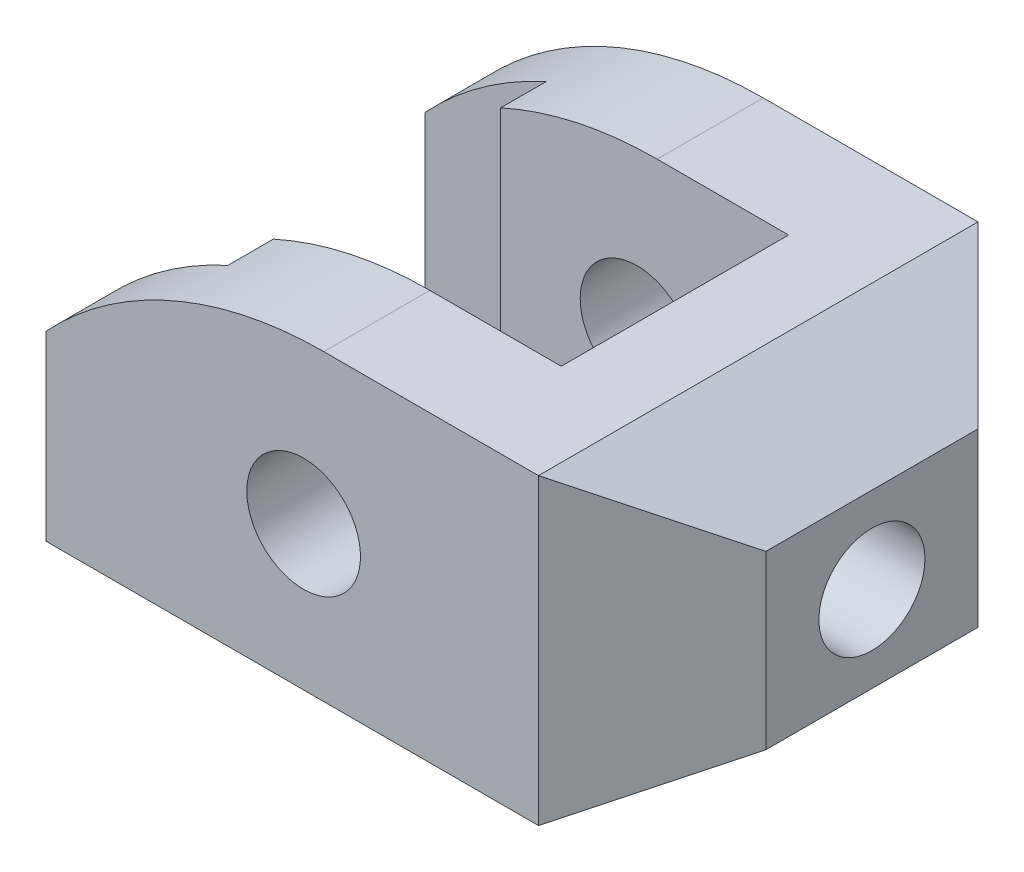
ISO-10303-21;
HEADER;
FILE_DESCRIPTION(('STEP AP214'),'2;1');
FILE_NAME('part.step','',(''),(''),'','','');
FILE_SCHEMA(('AUTOMOTIVE_DESIGN { 1 0 10303 214 1 1 1 1 }'));
ENDSEC;
DATA;
#1=APPLICATION_CONTEXT('core data for automotive mechanical design processes');
#2=APPLICATION_PROTOCOL_DEFINITION('international standard','automotive_design',2000,#1);
#3=PRODUCT_CONTEXT('',#1,'mechanical');
#4=PRODUCT('Part','Part','',(#3));
#5=PRODUCT_RELATED_PRODUCT_CATEGORY('part','',(#4));
#6=PRODUCT_DEFINITION_FORMATION('','',#4);
#7=PRODUCT_DEFINITION_CONTEXT('part definition',#1,'design');
#8=PRODUCT_DEFINITION('design','',#6,#7);
#9=PRODUCT_DEFINITION_SHAPE('','',#8);
#10=(LENGTH_UNIT() NAMED_UNIT(*) SI_UNIT(.MILLI.,.METRE.));
#11=(NAMED_UNIT(*) PLANE_ANGLE_UNIT() SI_UNIT($,.RADIAN.));
#12=(NAMED_UNIT(*) SI_UNIT($,.STERADIAN.) SOLID_ANGLE_UNIT());
#13=UNCERTAINTY_MEASURE_WITH_UNIT(LENGTH_MEASURE(1.E-05),#10,'distance_accuracy_value','');
#14=(GEOMETRIC_REPRESENTATION_CONTEXT(3) GLOBAL_UNCERTAINTY_ASSIGNED_CONTEXT((#13)) GLOBAL_UNIT_ASSIGNED_CONTEXT((#10,
#11,#12)) REPRESENTATION_CONTEXT('',''));
#15=CARTESIAN_POINT('',(0.,0.,0.));
#16=DIRECTION('',(0.,0.,1.));
#17=DIRECTION('',(1.,0.,0.));
#18=AXIS2_PLACEMENT_3D('',#15,#16,#17);
#19=CARTESIAN_POINT('',(36.6606055596467,-10.,29.));
#20=DIRECTION('',(0.,0.,1.));
#21=DIRECTION('',(1.,0.,0.));
#22=AXIS2_PLACEMENT_3D('',#19,#20,#21);
#23=PLANE('',#22);
#24=CARTESIAN_POINT('',(34.,19.,29.));
#25=DIRECTION('',(0.,0.,1.));
#26=DIRECTION('',(1.,0.,0.));
#27=AXIS2_PLACEMENT_3D('',#24,#25,#26);
#28=CIRCLE('',#27,7.5);
#29=CARTESIAN_POINT('',(26.5,19.,29.));
#30=VERTEX_POINT('',#29);
#31=EDGE_CURVE('E278',#30,#30,#28,.T.);
#32=ORIENTED_EDGE('',*,*,#31,.F.);
#33=EDGE_LOOP('',(#32));
#34=FACE_BOUND('',#33,.T.);
#35=DIRECTION('',(1.,0.,0.));
#36=VECTOR('',#35,1.);
#37=CARTESIAN_POINT('',(0.,0.,29.));
#38=LINE('',#37,#36);
#39=CARTESIAN_POINT('',(0.,0.,29.));
#40=VERTEX_POINT('',#39);
#41=CARTESIAN_POINT('',(65.,0.,29.));
#42=VERTEX_POINT('',#41);
#43=EDGE_CURVE('E252',#40,#42,#38,.T.);
#44=ORIENTED_EDGE('',*,*,#43,.T.);
#45=DIRECTION('',(0.,-1.,0.));
#46=VECTOR('',#45,1.);
#47=CARTESIAN_POINT('',(65.,58.,29.));
#48=LINE('',#47,#46);
#49=CARTESIAN_POINT('',(65.,40.,29.));
#50=VERTEX_POINT('',#49);
#51=EDGE_CURVE('E242',#50,#42,#48,.T.);
#52=ORIENTED_EDGE('',*,*,#51,.F.);
#53=DIRECTION('',(-1.,0.,0.));
#54=VECTOR('',#53,1.);
#55=CARTESIAN_POINT('',(65.,40.,29.));
#56=LINE('',#55,#54);
#57=CARTESIAN_POINT('',(36.6606055596467,40.,29.));
#58=VERTEX_POINT('',#57);
#59=EDGE_CURVE('E249',#50,#58,#56,.T.);
#60=ORIENTED_EDGE('',*,*,#59,.T.);
#61=CARTESIAN_POINT('',(36.6606055596467,-10.,29.));
#62=DIRECTION('',(0.,0.,1.));
#63=DIRECTION('',(1.,0.,0.));
#64=AXIS2_PLACEMENT_3D('',#61,#62,#63);
#65=CIRCLE('',#64,50.);
#66=CARTESIAN_POINT('',(0.,24.,29.));
#67=VERTEX_POINT('',#66);
#68=EDGE_CURVE('E267',#58,#67,#65,.T.);
#69=ORIENTED_EDGE('',*,*,#68,.T.);
#70=DIRECTION('',(0.,-1.,0.));
#71=VECTOR('',#70,1.);
#72=CARTESIAN_POINT('',(0.,0.,29.));
#73=LINE('',#72,#71);
#74=EDGE_CURVE('E273',#67,#40,#73,.T.);
#75=ORIENTED_EDGE('',*,*,#74,.T.);
#76=EDGE_LOOP('',(#44,#52,#60,#69,#75));
#77=FACE_BOUND('',#76,.T.);
#78=ADVANCED_FACE('F44',(#34,#77),#23,.T.);
#79=CARTESIAN_POINT('',(36.6606055596467,-10.,-29.));
#80=DIRECTION('',(0.,0.,1.));
#81=DIRECTION('',(1.,0.,0.));
#82=AXIS2_PLACEMENT_3D('',#79,#80,#81);
#83=PLANE('',#82);
#84=CARTESIAN_POINT('',(34.,19.,-29.));
#85=DIRECTION('',(0.,0.,1.));
#86=DIRECTION('',(1.,0.,0.));
#87=AXIS2_PLACEMENT_3D('',#84,#85,#86);
#88=CIRCLE('',#87,7.5);
#89=CARTESIAN_POINT('',(26.5,19.,-29.));
#90=VERTEX_POINT('',#89);
#91=EDGE_CURVE('E361',#90,#90,#88,.T.);
#92=ORIENTED_EDGE('',*,*,#91,.T.);
#93=EDGE_LOOP('',(#92));
#94=FACE_BOUND('',#93,.T.);
#95=DIRECTION('',(0.,-1.,0.));
#96=VECTOR('',#95,1.);
#97=CARTESIAN_POINT('',(65.,58.,-29.));
#98=LINE('',#97,#96);
#99=CARTESIAN_POINT('',(65.,40.,-29.));
#100=VERTEX_POINT('',#99);
#101=CARTESIAN_POINT('',(65.,0.,-29.));
#102=VERTEX_POINT('',#101);
#103=EDGE_CURVE('E160',#100,#102,#98,.T.);
#104=ORIENTED_EDGE('',*,*,#103,.T.);
#105=DIRECTION('',(1.,0.,0.));
#106=VECTOR('',#105,1.);
#107=CARTESIAN_POINT('',(0.,0.,-29.));
#108=LINE('',#107,#106);
#109=CARTESIAN_POINT('',(0.,0.,-29.));
#110=VERTEX_POINT('',#109);
#111=EDGE_CURVE('E178',#110,#102,#108,.T.);
#112=ORIENTED_EDGE('',*,*,#111,.F.);
#113=DIRECTION('',(0.,-1.,0.));
#114=VECTOR('',#113,1.);
#115=CARTESIAN_POINT('',(0.,0.,-29.));
#116=LINE('',#115,#114);
#117=CARTESIAN_POINT('',(0.,24.,-29.));
#118=VERTEX_POINT('',#117);
#119=EDGE_CURVE('E194',#118,#110,#116,.T.);
#120=ORIENTED_EDGE('',*,*,#119,.F.);
#121=CARTESIAN_POINT('',(36.6606055596467,-10.,-29.));
#122=DIRECTION('',(0.,0.,1.));
#123=DIRECTION('',(1.,0.,0.));
#124=AXIS2_PLACEMENT_3D('',#121,#122,#123);
#125=CIRCLE('',#124,50.);
#126=CARTESIAN_POINT('',(36.6606055596467,40.,-29.));
#127=VERTEX_POINT('',#126);
#128=EDGE_CURVE('E282',#127,#118,#125,.T.);
#129=ORIENTED_EDGE('',*,*,#128,.F.);
#130=DIRECTION('',(-1.,0.,0.));
#131=VECTOR('',#130,1.);
#132=CARTESIAN_POINT('',(65.,40.,-29.));
#133=LINE('',#132,#131);
#134=EDGE_CURVE('E182',#100,#127,#133,.T.);
#135=ORIENTED_EDGE('',*,*,#134,.F.);
#136=EDGE_LOOP('',(#104,#112,#120,#129,#135));
#137=FACE_BOUND('',#136,.T.);
#138=ADVANCED_FACE('F176',(#94,#137),#83,.F.);
#139=CARTESIAN_POINT('',(65.,0.,29.));
#140=DIRECTION('',(-0.500000000000001,0.866025403784438,0.));
#141=DIRECTION('',(-0.866025403784438,-0.500000000000001,0.));
#142=AXIS2_PLACEMENT_3D('',#139,#140,#141);
#143=PLANE('',#142);
#144=DIRECTION('',(-0.65465367070798,-0.37796447300923,-0.654653670707973));
#145=VECTOR('',#144,1.);
#146=CARTESIAN_POINT('',(89.8571428571428,14.3512781198564,-4.14285714285747));
#147=LINE('',#146,#145);
#148=CARTESIAN_POINT('',(80.,8.66025403784443,-14.0000000000002));
#149=VERTEX_POINT('',#148);
#150=EDGE_CURVE('E157',#149,#102,#147,.T.);
#151=ORIENTED_EDGE('',*,*,#150,.F.);
#152=DIRECTION('',(0.,0.,-1.));
#153=VECTOR('',#152,1.);
#154=CARTESIAN_POINT('',(80.,8.66025403784441,29.));
#155=LINE('',#154,#153);
#156=CARTESIAN_POINT('',(80.,8.66025403784443,14.0000000000002));
#157=VERTEX_POINT('',#156);
#158=EDGE_CURVE('E200',#157,#149,#155,.T.);
#159=ORIENTED_EDGE('',*,*,#158,.F.);
#160=DIRECTION('',(0.65465367070798,0.37796447300923,-0.654653670707973));
#161=VECTOR('',#160,1.);
#162=CARTESIAN_POINT('',(65.,0.,29.));
#163=LINE('',#162,#161);
#164=EDGE_CURVE('E170',#42,#157,#163,.T.);
#165=ORIENTED_EDGE('',*,*,#164,.F.);
#166=DIRECTION('',(0.,0.,-1.));
#167=VECTOR('',#166,1.);
#168=CARTESIAN_POINT('',(65.,0.,29.));
#169=LINE('',#168,#167);
#170=EDGE_CURVE('E189',#42,#102,#169,.T.);
#171=ORIENTED_EDGE('',*,*,#170,.T.);
#172=EDGE_LOOP('',(#151,#159,#165,#171));
#173=FACE_BOUND('',#172,.T.);
#174=ADVANCED_FACE('F197',(#173),#143,.F.);
#175=CARTESIAN_POINT('',(80.,8.66025403784441,29.));
#176=DIRECTION('',(-1.,0.,0.));
#177=DIRECTION('',(0.,0.,1.));
#178=AXIS2_PLACEMENT_3D('',#175,#176,#177);
#179=PLANE('',#178);
#180=CARTESIAN_POINT('',(80.,20.,0.));
#181=DIRECTION('',(1.,0.,0.));
#182=DIRECTION('',(0.,0.,-1.));
#183=AXIS2_PLACEMENT_3D('',#180,#181,#182);
#184=CIRCLE('',#183,7.);
#185=CARTESIAN_POINT('',(80.,20.,-7.));
#186=VERTEX_POINT('',#185);
#187=EDGE_CURVE('E298',#186,#186,#184,.T.);
#188=ORIENTED_EDGE('',*,*,#187,.F.);
#189=EDGE_LOOP('',(#188));
#190=FACE_BOUND('',#189,.T.);
#191=DIRECTION('',(0.,-1.,0.));
#192=VECTOR('',#191,1.);
#193=CARTESIAN_POINT('',(80.,58.,-14.0000000000002));
#194=LINE('',#193,#192);
#195=CARTESIAN_POINT('',(80.,31.3397459621556,-14.0000000000002));
#196=VERTEX_POINT('',#195);
#197=EDGE_CURVE('E163',#196,#149,#194,.T.);
#198=ORIENTED_EDGE('',*,*,#197,.F.);
#199=DIRECTION('',(0.,0.,-1.));
#200=VECTOR('',#199,1.);
#201=CARTESIAN_POINT('',(80.,31.3397459621556,29.));
#202=LINE('',#201,#200);
#203=CARTESIAN_POINT('',(80.,31.3397459621556,14.0000000000002));
#204=VERTEX_POINT('',#203);
#205=EDGE_CURVE('E206',#204,#196,#202,.T.);
#206=ORIENTED_EDGE('',*,*,#205,.F.);
#207=DIRECTION('',(0.,-1.,0.));
#208=VECTOR('',#207,1.);
#209=CARTESIAN_POINT('',(80.,58.,14.0000000000002));
#210=LINE('',#209,#208);
#211=EDGE_CURVE('E61',#204,#157,#210,.T.);
#212=ORIENTED_EDGE('',*,*,#211,.T.);
#213=ORIENTED_EDGE('',*,*,#158,.T.);
#214=EDGE_LOOP('',(#198,#206,#212,#213));
#215=FACE_BOUND('',#214,.T.);
#216=ADVANCED_FACE('F294',(#190,#215),#179,.F.);
#217=CARTESIAN_POINT('',(80.,31.3397459621556,29.));
#218=DIRECTION('',(-0.500000000000001,-0.866025403784438,0.));
#219=DIRECTION('',(0.866025403784438,-0.500000000000001,0.));
#220=AXIS2_PLACEMENT_3D('',#217,#218,#219);
#221=PLANE('',#220);
#222=DIRECTION('',(0.65465367070798,-0.37796447300923,0.654653670707973));
#223=VECTOR('',#222,1.);
#224=CARTESIAN_POINT('',(98.4285714285715,20.7000052870896,4.4285714285711));
#225=LINE('',#224,#223);
#226=EDGE_CURVE('E11',#100,#196,#225,.T.);
#227=ORIENTED_EDGE('',*,*,#226,.F.);
#228=DIRECTION('',(0.,0.,-1.));
#229=VECTOR('',#228,1.);
#230=CARTESIAN_POINT('',(65.,40.,29.));
#231=LINE('',#230,#229);
#232=EDGE_CURVE('E256',#50,#100,#231,.T.);
#233=ORIENTED_EDGE('',*,*,#232,.F.);
#234=DIRECTION('',(-0.65465367070798,0.37796447300923,0.654653670707973));
#235=VECTOR('',#234,1.);
#236=CARTESIAN_POINT('',(73.5714285714287,35.051283406946,20.4285714285714));
#237=LINE('',#236,#235);
#238=EDGE_CURVE('E54',#204,#50,#237,.T.);
#239=ORIENTED_EDGE('',*,*,#238,.F.);
#240=ORIENTED_EDGE('',*,*,#205,.T.);
#241=EDGE_LOOP('',(#227,#233,#239,#240));
#242=FACE_BOUND('',#241,.T.);
#243=ADVANCED_FACE('F257',(#242),#221,.F.);
#244=CARTESIAN_POINT('',(0.,0.,29.));
#245=DIRECTION('',(1.,0.,0.));
#246=DIRECTION('',(0.,0.,-1.));
#247=AXIS2_PLACEMENT_3D('',#244,#245,#246);
#248=PLANE('',#247);
#249=DIRECTION('',(0.,-1.,0.));
#250=VECTOR('',#249,1.);
#251=CARTESIAN_POINT('',(0.,58.,21.));
#252=LINE('',#251,#250);
#253=CARTESIAN_POINT('',(0.,24.,21.));
#254=VERTEX_POINT('',#253);
#255=CARTESIAN_POINT('',(0.,0.,21.));
#256=VERTEX_POINT('',#255);
#257=EDGE_CURVE('E218',#254,#256,#252,.T.);
#258=ORIENTED_EDGE('',*,*,#257,.T.);
#259=DIRECTION('',(0.,0.,-1.));
#260=VECTOR('',#259,1.);
#261=CARTESIAN_POINT('',(0.,0.,29.));
#262=LINE('',#261,#260);
#263=EDGE_CURVE('E204',#40,#256,#262,.T.);
#264=ORIENTED_EDGE('',*,*,#263,.F.);
#265=ORIENTED_EDGE('',*,*,#74,.F.);
#266=DIRECTION('',(0.,0.,-1.));
#267=VECTOR('',#266,1.);
#268=CARTESIAN_POINT('',(0.,24.,29.));
#269=LINE('',#268,#267);
#270=EDGE_CURVE('E286',#67,#254,#269,.T.);
#271=ORIENTED_EDGE('',*,*,#270,.T.);
#272=EDGE_LOOP('',(#258,#264,#265,#271));
#273=FACE_BOUND('',#272,.T.);
#274=ADVANCED_FACE('F46',(#273),#248,.F.);
#275=DIRECTION('',(0.,-1.,0.));
#276=VECTOR('',#275,1.);
#277=CARTESIAN_POINT('',(0.,58.,-21.));
#278=LINE('',#277,#276);
#279=CARTESIAN_POINT('',(0.,24.,-21.));
#280=VERTEX_POINT('',#279);
#281=CARTESIAN_POINT('',(0.,0.,-21.));
#282=VERTEX_POINT('',#281);
#283=EDGE_CURVE('E329',#280,#282,#278,.T.);
#284=ORIENTED_EDGE('',*,*,#283,.F.);
#285=EDGE_CURVE('E271',#280,#118,#269,.T.);
#286=ORIENTED_EDGE('',*,*,#285,.T.);
#287=ORIENTED_EDGE('',*,*,#119,.T.);
#288=EDGE_CURVE('E192',#282,#110,#262,.T.);
#289=ORIENTED_EDGE('',*,*,#288,.F.);
#290=EDGE_LOOP('',(#284,#286,#287,#289));
#291=FACE_BOUND('',#290,.T.);
#292=ADVANCED_FACE('F403',(#291),#248,.F.);
#293=CARTESIAN_POINT('',(0.,0.,29.));
#294=DIRECTION('',(0.,1.,0.));
#295=DIRECTION('',(0.,0.,1.));
#296=AXIS2_PLACEMENT_3D('',#293,#294,#295);
#297=PLANE('',#296);
#298=DIRECTION('',(1.,0.,0.));
#299=VECTOR('',#298,1.);
#300=CARTESIAN_POINT('',(0.,0.,21.));
#301=LINE('',#300,#299);
#302=CARTESIAN_POINT('',(16.,0.,21.));
#303=VERTEX_POINT('',#302);
#304=EDGE_CURVE('E169',#256,#303,#301,.T.);
#305=ORIENTED_EDGE('',*,*,#304,.T.);
#306=DIRECTION('',(0.,0.,-1.));
#307=VECTOR('',#306,1.);
#308=CARTESIAN_POINT('',(16.,0.,15.));
#309=LINE('',#308,#307);
#310=CARTESIAN_POINT('',(16.,0.,15.));
#311=VERTEX_POINT('',#310);
#312=EDGE_CURVE('E306',#303,#311,#309,.T.);
#313=ORIENTED_EDGE('',*,*,#312,.T.);
#314=DIRECTION('',(1.,0.,0.));
#315=VECTOR('',#314,1.);
#316=CARTESIAN_POINT('',(16.,0.,15.));
#317=LINE('',#316,#315);
#318=CARTESIAN_POINT('',(54.,0.,15.));
#319=VERTEX_POINT('',#318);
#320=EDGE_CURVE('E310',#311,#319,#317,.T.);
#321=ORIENTED_EDGE('',*,*,#320,.T.);
#322=DIRECTION('',(0.,0.,-1.));
#323=VECTOR('',#322,1.);
#324=CARTESIAN_POINT('',(54.,0.,-15.));
#325=LINE('',#324,#323);
#326=CARTESIAN_POINT('',(54.,0.,-15.));
#327=VERTEX_POINT('',#326);
#328=EDGE_CURVE('E314',#319,#327,#325,.T.);
#329=ORIENTED_EDGE('',*,*,#328,.T.);
#330=DIRECTION('',(-1.,0.,0.));
#331=VECTOR('',#330,1.);
#332=CARTESIAN_POINT('',(16.,0.,-15.));
#333=LINE('',#332,#331);
#334=CARTESIAN_POINT('',(16.,0.,-15.));
#335=VERTEX_POINT('',#334);
#336=EDGE_CURVE('E318',#327,#335,#333,.T.);
#337=ORIENTED_EDGE('',*,*,#336,.T.);
#338=DIRECTION('',(0.,0.,-1.));
#339=VECTOR('',#338,1.);
#340=CARTESIAN_POINT('',(16.,0.,-21.));
#341=LINE('',#340,#339);
#342=CARTESIAN_POINT('',(16.,0.,-21.));
#343=VERTEX_POINT('',#342);
#344=EDGE_CURVE('E322',#335,#343,#341,.T.);
#345=ORIENTED_EDGE('',*,*,#344,.T.);
#346=DIRECTION('',(-1.,0.,0.));
#347=VECTOR('',#346,1.);
#348=CARTESIAN_POINT('',(0.,0.,-21.));
#349=LINE('',#348,#347);
#350=EDGE_CURVE('E326',#343,#282,#349,.T.);
#351=ORIENTED_EDGE('',*,*,#350,.T.);
#352=ORIENTED_EDGE('',*,*,#288,.T.);
#353=ORIENTED_EDGE('',*,*,#111,.T.);
#354=ORIENTED_EDGE('',*,*,#170,.F.);
#355=ORIENTED_EDGE('',*,*,#43,.F.);
#356=ORIENTED_EDGE('',*,*,#263,.T.);
#357=EDGE_LOOP('',(#305,#313,#321,#329,#337,#345,#351,#352,#353,#354,#355,#356));
#358=FACE_BOUND('',#357,.T.);
#359=ADVANCED_FACE('F188',(#358),#297,.F.);
#360=CARTESIAN_POINT('',(65.,40.,29.));
#361=DIRECTION('',(0.,-1.,0.));
#362=DIRECTION('',(1.,0.,0.));
#363=AXIS2_PLACEMENT_3D('',#360,#361,#362);
#364=PLANE('',#363);
#365=DIRECTION('',(1.,0.,0.));
#366=VECTOR('',#365,1.);
#367=CARTESIAN_POINT('',(65.,40.,15.));
#368=LINE('',#367,#366);
#369=CARTESIAN_POINT('',(36.6606055596467,40.,15.));
#370=VERTEX_POINT('',#369);
#371=CARTESIAN_POINT('',(54.,40.,15.));
#372=VERTEX_POINT('',#371);
#373=EDGE_CURVE('E358',#370,#372,#368,.T.);
#374=ORIENTED_EDGE('',*,*,#373,.F.);
#375=DIRECTION('',(0.,0.,-1.));
#376=VECTOR('',#375,1.);
#377=CARTESIAN_POINT('',(36.6606055596467,40.,29.));
#378=LINE('',#377,#376);
#379=EDGE_CURVE('E260',#58,#370,#378,.T.);
#380=ORIENTED_EDGE('',*,*,#379,.F.);
#381=ORIENTED_EDGE('',*,*,#59,.F.);
#382=ORIENTED_EDGE('',*,*,#232,.T.);
#383=ORIENTED_EDGE('',*,*,#134,.T.);
#384=CARTESIAN_POINT('',(36.6606055596467,40.,-15.));
#385=VERTEX_POINT('',#384);
#386=EDGE_CURVE('E290',#385,#127,#378,.T.);
#387=ORIENTED_EDGE('',*,*,#386,.F.);
#388=DIRECTION('',(-1.,0.,0.));
#389=VECTOR('',#388,1.);
#390=CARTESIAN_POINT('',(65.,40.,-15.));
#391=LINE('',#390,#389);
#392=CARTESIAN_POINT('',(54.,40.,-15.));
#393=VERTEX_POINT('',#392);
#394=EDGE_CURVE('E224',#393,#385,#391,.T.);
#395=ORIENTED_EDGE('',*,*,#394,.F.);
#396=DIRECTION('',(0.,0.,-1.));
#397=VECTOR('',#396,1.);
#398=CARTESIAN_POINT('',(54.,40.,29.));
#399=LINE('',#398,#397);
#400=EDGE_CURVE('E236',#372,#393,#399,.T.);
#401=ORIENTED_EDGE('',*,*,#400,.F.);
#402=EDGE_LOOP('',(#374,#380,#381,#382,#383,#387,#395,#401));
#403=FACE_BOUND('',#402,.T.);
#404=ADVANCED_FACE('F263',(#403),#364,.F.);
#405=CARTESIAN_POINT('',(36.6606055596467,-10.,29.));
#406=DIRECTION('',(0.,0.,-1.));
#407=DIRECTION('',(-1.,0.,0.));
#408=AXIS2_PLACEMENT_3D('',#405,#406,#407);
#409=CYLINDRICAL_SURFACE('',#408,50.);
#410=CARTESIAN_POINT('',(36.6606055596467,-10.,21.));
#411=DIRECTION('',(0.,0.,-1.));
#412=DIRECTION('',(-1.,0.,0.));
#413=AXIS2_PLACEMENT_3D('',#410,#411,#412);
#414=CIRCLE('',#413,50.);
#415=CARTESIAN_POINT('',(16.,35.5317403347236,21.));
#416=VERTEX_POINT('',#415);
#417=EDGE_CURVE('E233',#254,#416,#414,.T.);
#418=ORIENTED_EDGE('',*,*,#417,.F.);
#419=ORIENTED_EDGE('',*,*,#270,.F.);
#420=ORIENTED_EDGE('',*,*,#68,.F.);
#421=ORIENTED_EDGE('',*,*,#379,.T.);
#422=CARTESIAN_POINT('',(36.6606055596467,-10.,15.));
#423=DIRECTION('',(0.,0.,-1.));
#424=DIRECTION('',(-1.,0.,0.));
#425=AXIS2_PLACEMENT_3D('',#422,#423,#424);
#426=CIRCLE('',#425,50.);
#427=CARTESIAN_POINT('',(16.,35.5317403347236,15.));
#428=VERTEX_POINT('',#427);
#429=EDGE_CURVE('E223',#428,#370,#426,.T.);
#430=ORIENTED_EDGE('',*,*,#429,.F.);
#431=DIRECTION('',(0.,0.,-1.));
#432=VECTOR('',#431,1.);
#433=CARTESIAN_POINT('',(16.,35.5317403347236,29.));
#434=LINE('',#433,#432);
#435=EDGE_CURVE('E230',#416,#428,#434,.T.);
#436=ORIENTED_EDGE('',*,*,#435,.F.);
#437=EDGE_LOOP('',(#418,#419,#420,#421,#430,#436));
#438=FACE_BOUND('',#437,.T.);
#439=ADVANCED_FACE('F412',(#438),#409,.T.);
#440=CARTESIAN_POINT('',(36.6606055596467,-10.,-15.));
#441=DIRECTION('',(0.,0.,1.));
#442=DIRECTION('',(1.,0.,0.));
#443=AXIS2_PLACEMENT_3D('',#440,#441,#442);
#444=CIRCLE('',#443,50.);
#445=CARTESIAN_POINT('',(16.,35.5317403347236,-15.));
#446=VERTEX_POINT('',#445);
#447=EDGE_CURVE('E217',#385,#446,#444,.T.);
#448=ORIENTED_EDGE('',*,*,#447,.F.);
#449=ORIENTED_EDGE('',*,*,#386,.T.);
#450=ORIENTED_EDGE('',*,*,#128,.T.);
#451=ORIENTED_EDGE('',*,*,#285,.F.);
#452=CARTESIAN_POINT('',(36.6606055596467,-10.,-21.));
#453=DIRECTION('',(0.,0.,1.));
#454=DIRECTION('',(1.,0.,0.));
#455=AXIS2_PLACEMENT_3D('',#452,#453,#454);
#456=CIRCLE('',#455,50.);
#457=CARTESIAN_POINT('',(16.,35.5317403347236,-21.));
#458=VERTEX_POINT('',#457);
#459=EDGE_CURVE('E212',#458,#280,#456,.T.);
#460=ORIENTED_EDGE('',*,*,#459,.F.);
#461=DIRECTION('',(0.,0.,-1.));
#462=VECTOR('',#461,1.);
#463=CARTESIAN_POINT('',(16.,35.5317403347236,29.));
#464=LINE('',#463,#462);
#465=EDGE_CURVE('E227',#446,#458,#464,.T.);
#466=ORIENTED_EDGE('',*,*,#465,.F.);
#467=EDGE_LOOP('',(#448,#449,#450,#451,#460,#466));
#468=FACE_BOUND('',#467,.T.);
#469=ADVANCED_FACE('F406',(#468),#409,.T.);
#470=CARTESIAN_POINT('',(34.,19.,29.));
#471=DIRECTION('',(0.,0.,-1.));
#472=DIRECTION('',(-1.,0.,0.));
#473=AXIS2_PLACEMENT_3D('',#470,#471,#472);
#474=CYLINDRICAL_SURFACE('',#473,7.5);
#475=CARTESIAN_POINT('',(34.,19.,15.));
#476=DIRECTION('',(0.,0.,-1.));
#477=DIRECTION('',(-1.,0.,0.));
#478=AXIS2_PLACEMENT_3D('',#475,#476,#477);
#479=CIRCLE('',#478,7.5);
#480=CARTESIAN_POINT('',(26.5,19.,15.));
#481=VERTEX_POINT('',#480);
#482=EDGE_CURVE('E219',#481,#481,#479,.T.);
#483=CARTESIAN_POINT('',(26.5,19.,29.));
#484=CARTESIAN_POINT('',(26.5,19.,28.8541666666667));
#485=CARTESIAN_POINT('',(26.5,19.,28.7083333333333));
#486=CARTESIAN_POINT('',(26.5,19.,28.4166666666667));
#487=CARTESIAN_POINT('',(26.5,19.,28.2708333333333));
#488=CARTESIAN_POINT('',(26.5,19.,27.9791666666667));
#489=CARTESIAN_POINT('',(26.5,19.,27.8333333333333));
#490=CARTESIAN_POINT('',(26.5,19.,27.5416666666667));
#491=CARTESIAN_POINT('',(26.5,19.,27.3958333333333));
#492=CARTESIAN_POINT('',(26.5,19.,27.1041666666667));
#493=CARTESIAN_POINT('',(26.5,19.,26.9583333333333));
#494=CARTESIAN_POINT('',(26.5,19.,26.6666666666667));
#495=CARTESIAN_POINT('',(26.5,19.,26.5208333333333));
#496=CARTESIAN_POINT('',(26.5,19.,26.2291666666667));
#497=CARTESIAN_POINT('',(26.5,19.,26.0833333333333));
#498=CARTESIAN_POINT('',(26.5,19.,25.7916666666667));
#499=CARTESIAN_POINT('',(26.5,19.,25.6458333333333));
#500=CARTESIAN_POINT('',(26.5,19.,25.3541666666667));
#501=CARTESIAN_POINT('',(26.5,19.,25.2083333333333));
#502=CARTESIAN_POINT('',(26.5,19.,24.9166666666667));
#503=CARTESIAN_POINT('',(26.5,19.,24.7708333333333));
#504=CARTESIAN_POINT('',(26.5,19.,24.4791666666667));
#505=CARTESIAN_POINT('',(26.5,19.,24.3333333333333));
#506=CARTESIAN_POINT('',(26.5,19.,24.0416666666667));
#507=CARTESIAN_POINT('',(26.5,19.,23.8958333333333));
#508=CARTESIAN_POINT('',(26.5,19.,23.6041666666667));
#509=CARTESIAN_POINT('',(26.5,19.,23.4583333333333));
#510=CARTESIAN_POINT('',(26.5,19.,23.1666666666667));
#511=CARTESIAN_POINT('',(26.5,19.,23.0208333333333));
#512=CARTESIAN_POINT('',(26.5,19.,22.7291666666667));
#513=CARTESIAN_POINT('',(26.5,19.,22.5833333333333));
#514=CARTESIAN_POINT('',(26.5,19.,22.2916666666667));
#515=CARTESIAN_POINT('',(26.5,19.,22.1458333333333));
#516=CARTESIAN_POINT('',(26.5,19.,21.8541666666667));
#517=CARTESIAN_POINT('',(26.5,19.,21.7083333333333));
#518=CARTESIAN_POINT('',(26.5,19.,21.4166666666667));
#519=CARTESIAN_POINT('',(26.5,19.,21.2708333333333));
#520=CARTESIAN_POINT('',(26.5,19.,20.9791666666667));
#521=CARTESIAN_POINT('',(26.5,19.,20.8333333333333));
#522=CARTESIAN_POINT('',(26.5,19.,20.5416666666667));
#523=CARTESIAN_POINT('',(26.5,19.,20.3958333333333));
#524=CARTESIAN_POINT('',(26.5,19.,20.1041666666667));
#525=CARTESIAN_POINT('',(26.5,19.,19.9583333333333));
#526=CARTESIAN_POINT('',(26.5,19.,19.6666666666667));
#527=CARTESIAN_POINT('',(26.5,19.,19.5208333333333));
#528=CARTESIAN_POINT('',(26.5,19.,19.2291666666667));
#529=CARTESIAN_POINT('',(26.5,19.,19.0833333333333));
#530=CARTESIAN_POINT('',(26.5,19.,18.7916666666667));
#531=CARTESIAN_POINT('',(26.5,19.,18.6458333333333));
#532=CARTESIAN_POINT('',(26.5,19.,18.3541666666667));
#533=CARTESIAN_POINT('',(26.5,19.,18.2083333333333));
#534=CARTESIAN_POINT('',(26.5,19.,17.9166666666667));
#535=CARTESIAN_POINT('',(26.5,19.,17.7708333333333));
#536=CARTESIAN_POINT('',(26.5,19.,17.4791666666667));
#537=CARTESIAN_POINT('',(26.5,19.,17.3333333333333));
#538=CARTESIAN_POINT('',(26.5,19.,17.0416666666667));
#539=CARTESIAN_POINT('',(26.5,19.,16.8958333333333));
#540=CARTESIAN_POINT('',(26.5,19.,16.6041666666667));
#541=CARTESIAN_POINT('',(26.5,19.,16.4583333333333));
#542=CARTESIAN_POINT('',(26.5,19.,16.1666666666667));
#543=CARTESIAN_POINT('',(26.5,19.,16.0208333333333));
#544=CARTESIAN_POINT('',(26.5,19.,15.7291666666667));
#545=CARTESIAN_POINT('',(26.5,19.,15.5833333333333));
#546=CARTESIAN_POINT('',(26.5,19.,15.2916666666667));
#547=CARTESIAN_POINT('',(26.5,19.,15.1458333333333));
#548=CARTESIAN_POINT('',(26.5,19.,15.));
#549=B_SPLINE_CURVE_WITH_KNOTS('',3,(#483,#484,#485,#486,#487,#488,#489,#490,#491,#492,#493,
#494,#495,#496,#497,#498,#499,#500,#501,#502,#503,#504,#505,#506,#507,#508,#509,#510,#511,#512,
#513,#514,#515,#516,#517,#518,#519,#520,#521,#522,#523,#524,#525,#526,#527,#528,#529,#530,#531,
#532,#533,#534,#535,#536,#537,#538,#539,#540,#541,#542,#543,#544,#545,#546,#547,#548),
.UNSPECIFIED.,.F.,.F.,(4,2,2,2,2,2,2,2,2,2,2,2,2,2,2,2,2,2,2,2,2,2,2,2,2,2,2,2,2,2,2,2,4),(0.,
0.437499999999997,0.874999999999997,1.3125,1.75,2.1875,2.625,3.0625,3.5,3.9375,4.375,4.8125,
5.25,5.6875,6.125,6.5625,7.,7.4375,7.875,8.3125,8.75,9.1875,9.625,10.0625,10.5,10.9375,11.375,
11.8125,12.25,12.6875,13.125,13.5625,14.),.UNSPECIFIED.);
#550=EDGE_CURVE('BSEAM419',#30,#481,#549,.T.);
#551=ORIENTED_EDGE('',*,*,#31,.T.);
#552=ORIENTED_EDGE('',*,*,#482,.T.);
#553=ORIENTED_EDGE('',*,*,#550,.T.);
#554=ORIENTED_EDGE('',*,*,#550,.F.);
#555=EDGE_LOOP('',(#551,#553,#552,#554));
#556=FACE_BOUND('',#555,.T.);
#557=ADVANCED_FACE('F419',(#556),#474,.F.);
#558=CARTESIAN_POINT('',(34.,19.,-15.));
#559=DIRECTION('',(0.,0.,1.));
#560=DIRECTION('',(1.,0.,0.));
#561=AXIS2_PLACEMENT_3D('',#558,#559,#560);
#562=CIRCLE('',#561,7.5);
#563=CARTESIAN_POINT('',(26.5,19.,-15.));
#564=VERTEX_POINT('',#563);
#565=EDGE_CURVE('E213',#564,#564,#562,.T.);
#566=CARTESIAN_POINT('',(26.5,19.,-29.));
#567=CARTESIAN_POINT('',(26.5,19.,-28.8541666666667));
#568=CARTESIAN_POINT('',(26.5,19.,-28.7083333333333));
#569=CARTESIAN_POINT('',(26.5,19.,-28.4166666666667));
#570=CARTESIAN_POINT('',(26.5,19.,-28.2708333333333));
#571=CARTESIAN_POINT('',(26.5,19.,-27.9791666666667));
#572=CARTESIAN_POINT('',(26.5,19.,-27.8333333333333));
#573=CARTESIAN_POINT('',(26.5,19.,-27.5416666666667));
#574=CARTESIAN_POINT('',(26.5,19.,-27.3958333333333));
#575=CARTESIAN_POINT('',(26.5,19.,-27.1041666666667));
#576=CARTESIAN_POINT('',(26.5,19.,-26.9583333333333));
#577=CARTESIAN_POINT('',(26.5,19.,-26.6666666666667));
#578=CARTESIAN_POINT('',(26.5,19.,-26.5208333333333));
#579=CARTESIAN_POINT('',(26.5,19.,-26.2291666666667));
#580=CARTESIAN_POINT('',(26.5,19.,-26.0833333333333));
#581=CARTESIAN_POINT('',(26.5,19.,-25.7916666666667));
#582=CARTESIAN_POINT('',(26.5,19.,-25.6458333333333));
#583=CARTESIAN_POINT('',(26.5,19.,-25.3541666666667));
#584=CARTESIAN_POINT('',(26.5,19.,-25.2083333333333));
#585=CARTESIAN_POINT('',(26.5,19.,-24.9166666666667));
#586=CARTESIAN_POINT('',(26.5,19.,-24.7708333333333));
#587=CARTESIAN_POINT('',(26.5,19.,-24.4791666666667));
#588=CARTESIAN_POINT('',(26.5,19.,-24.3333333333333));
#589=CARTESIAN_POINT('',(26.5,19.,-24.0416666666667));
#590=CARTESIAN_POINT('',(26.5,19.,-23.8958333333333));
#591=CARTESIAN_POINT('',(26.5,19.,-23.6041666666667));
#592=CARTESIAN_POINT('',(26.5,19.,-23.4583333333333));
#593=CARTESIAN_POINT('',(26.5,19.,-23.1666666666667));
#594=CARTESIAN_POINT('',(26.5,19.,-23.0208333333333));
#595=CARTESIAN_POINT('',(26.5,19.,-22.7291666666667));
#596=CARTESIAN_POINT('',(26.5,19.,-22.5833333333333));
#597=CARTESIAN_POINT('',(26.5,19.,-22.2916666666667));
#598=CARTESIAN_POINT('',(26.5,19.,-22.1458333333333));
#599=CARTESIAN_POINT('',(26.5,19.,-21.8541666666667));
#600=CARTESIAN_POINT('',(26.5,19.,-21.7083333333333));
#601=CARTESIAN_POINT('',(26.5,19.,-21.4166666666667));
#602=CARTESIAN_POINT('',(26.5,19.,-21.2708333333333));
#603=CARTESIAN_POINT('',(26.5,19.,-20.9791666666667));
#604=CARTESIAN_POINT('',(26.5,19.,-20.8333333333333));
#605=CARTESIAN_POINT('',(26.5,19.,-20.5416666666667));
#606=CARTESIAN_POINT('',(26.5,19.,-20.3958333333333));
#607=CARTESIAN_POINT('',(26.5,19.,-20.1041666666667));
#608=CARTESIAN_POINT('',(26.5,19.,-19.9583333333333));
#609=CARTESIAN_POINT('',(26.5,19.,-19.6666666666667));
#610=CARTESIAN_POINT('',(26.5,19.,-19.5208333333333));
#611=CARTESIAN_POINT('',(26.5,19.,-19.2291666666667));
#612=CARTESIAN_POINT('',(26.5,19.,-19.0833333333333));
#613=CARTESIAN_POINT('',(26.5,19.,-18.7916666666667));
#614=CARTESIAN_POINT('',(26.5,19.,-18.6458333333333));
#615=CARTESIAN_POINT('',(26.5,19.,-18.3541666666667));
#616=CARTESIAN_POINT('',(26.5,19.,-18.2083333333333));
#617=CARTESIAN_POINT('',(26.5,19.,-17.9166666666667));
#618=CARTESIAN_POINT('',(26.5,19.,-17.7708333333333));
#619=CARTESIAN_POINT('',(26.5,19.,-17.4791666666667));
#620=CARTESIAN_POINT('',(26.5,19.,-17.3333333333333));
#621=CARTESIAN_POINT('',(26.5,19.,-17.0416666666667));
#622=CARTESIAN_POINT('',(26.5,19.,-16.8958333333333));
#623=CARTESIAN_POINT('',(26.5,19.,-16.6041666666667));
#624=CARTESIAN_POINT('',(26.5,19.,-16.4583333333333));
#625=CARTESIAN_POINT('',(26.5,19.,-16.1666666666667));
#626=CARTESIAN_POINT('',(26.5,19.,-16.0208333333333));
#627=CARTESIAN_POINT('',(26.5,19.,-15.7291666666667));
#628=CARTESIAN_POINT('',(26.5,19.,-15.5833333333333));
#629=CARTESIAN_POINT('',(26.5,19.,-15.2916666666667));
#630=CARTESIAN_POINT('',(26.5,19.,-15.1458333333333));
#631=CARTESIAN_POINT('',(26.5,19.,-15.));
#632=B_SPLINE_CURVE_WITH_KNOTS('',3,(#566,#567,#568,#569,#570,#571,#572,#573,#574,#575,#576,
#577,#578,#579,#580,#581,#582,#583,#584,#585,#586,#587,#588,#589,#590,#591,#592,#593,#594,#595,
#596,#597,#598,#599,#600,#601,#602,#603,#604,#605,#606,#607,#608,#609,#610,#611,#612,#613,#614,
#615,#616,#617,#618,#619,#620,#621,#622,#623,#624,#625,#626,#627,#628,#629,#630,#631),
.UNSPECIFIED.,.F.,.F.,(4,2,2,2,2,2,2,2,2,2,2,2,2,2,2,2,2,2,2,2,2,2,2,2,2,2,2,2,2,2,2,2,4),(0.,
0.4375,0.875000000000001,1.3125,1.75,2.1875,2.625,3.0625,3.5,3.9375,4.375,4.8125,5.25,5.6875,
6.125,6.5625,7.,7.4375,7.875,8.3125,8.75,9.1875,9.62499999999999,10.0625,10.5,10.9375,11.375,
11.8125,12.25,12.6875,13.125,13.5625,14.),.UNSPECIFIED.);
#633=EDGE_CURVE('BSEAM435',#90,#564,#632,.T.);
#634=ORIENTED_EDGE('',*,*,#91,.F.);
#635=ORIENTED_EDGE('',*,*,#565,.T.);
#636=ORIENTED_EDGE('',*,*,#633,.T.);
#637=ORIENTED_EDGE('',*,*,#633,.F.);
#638=EDGE_LOOP('',(#634,#636,#635,#637));
#639=FACE_BOUND('',#638,.T.);
#640=ADVANCED_FACE('F435',(#639),#474,.F.);
#641=CARTESIAN_POINT('',(54.,58.,-15.));
#642=DIRECTION('',(-1.,0.,0.));
#643=DIRECTION('',(0.,0.,1.));
#644=AXIS2_PLACEMENT_3D('',#641,#642,#643);
#645=PLANE('',#644);
#646=CARTESIAN_POINT('',(54.,20.,0.));
#647=DIRECTION('',(-1.,0.,0.));
#648=DIRECTION('',(0.,0.,1.));
#649=AXIS2_PLACEMENT_3D('',#646,#647,#648);
#650=CIRCLE('',#649,7.);
#651=CARTESIAN_POINT('',(54.,20.,-7.));
#652=VERTEX_POINT('',#651);
#653=EDGE_CURVE('E48',#652,#652,#650,.T.);
#654=ORIENTED_EDGE('',*,*,#653,.F.);
#655=EDGE_LOOP('',(#654));
#656=FACE_BOUND('',#655,.T.);
#657=ORIENTED_EDGE('',*,*,#400,.T.);
#658=DIRECTION('',(0.,-1.,0.));
#659=VECTOR('',#658,1.);
#660=CARTESIAN_POINT('',(54.,58.,-15.));
#661=LINE('',#660,#659);
#662=EDGE_CURVE('E337',#393,#327,#661,.T.);
#663=ORIENTED_EDGE('',*,*,#662,.T.);
#664=ORIENTED_EDGE('',*,*,#328,.F.);
#665=DIRECTION('',(0.,-1.,0.));
#666=VECTOR('',#665,1.);
#667=CARTESIAN_POINT('',(54.,58.,15.));
#668=LINE('',#667,#666);
#669=EDGE_CURVE('E340',#372,#319,#668,.T.);
#670=ORIENTED_EDGE('',*,*,#669,.F.);
#671=EDGE_LOOP('',(#657,#663,#664,#670));
#672=FACE_BOUND('',#671,.T.);
#673=ADVANCED_FACE('F389',(#656,#672),#645,.T.);
#674=CARTESIAN_POINT('',(0.,58.,21.));
#675=DIRECTION('',(0.,0.,-1.));
#676=DIRECTION('',(-1.,0.,0.));
#677=AXIS2_PLACEMENT_3D('',#674,#675,#676);
#678=PLANE('',#677);
#679=ORIENTED_EDGE('',*,*,#417,.T.);
#680=DIRECTION('',(0.,-1.,0.));
#681=VECTOR('',#680,1.);
#682=CARTESIAN_POINT('',(16.,58.,21.));
#683=LINE('',#682,#681);
#684=EDGE_CURVE('E346',#416,#303,#683,.T.);
#685=ORIENTED_EDGE('',*,*,#684,.T.);
#686=ORIENTED_EDGE('',*,*,#304,.F.);
#687=ORIENTED_EDGE('',*,*,#257,.F.);
#688=EDGE_LOOP('',(#679,#685,#686,#687));
#689=FACE_BOUND('',#688,.T.);
#690=ADVANCED_FACE('F374',(#689),#678,.T.);
#691=CARTESIAN_POINT('',(16.,58.,15.));
#692=DIRECTION('',(-1.,0.,0.));
#693=DIRECTION('',(0.,0.,1.));
#694=AXIS2_PLACEMENT_3D('',#691,#692,#693);
#695=PLANE('',#694);
#696=ORIENTED_EDGE('',*,*,#435,.T.);
#697=DIRECTION('',(0.,-1.,0.));
#698=VECTOR('',#697,1.);
#699=CARTESIAN_POINT('',(16.,58.,15.));
#700=LINE('',#699,#698);
#701=EDGE_CURVE('E343',#428,#311,#700,.T.);
#702=ORIENTED_EDGE('',*,*,#701,.T.);
#703=ORIENTED_EDGE('',*,*,#312,.F.);
#704=ORIENTED_EDGE('',*,*,#684,.F.);
#705=EDGE_LOOP('',(#696,#702,#703,#704));
#706=FACE_BOUND('',#705,.T.);
#707=ADVANCED_FACE('F379',(#706),#695,.T.);
#708=CARTESIAN_POINT('',(16.,58.,-21.));
#709=DIRECTION('',(-1.,0.,0.));
#710=DIRECTION('',(0.,0.,1.));
#711=AXIS2_PLACEMENT_3D('',#708,#709,#710);
#712=PLANE('',#711);
#713=ORIENTED_EDGE('',*,*,#465,.T.);
#714=DIRECTION('',(0.,-1.,0.));
#715=VECTOR('',#714,1.);
#716=CARTESIAN_POINT('',(16.,58.,-21.));
#717=LINE('',#716,#715);
#718=EDGE_CURVE('E69',#458,#343,#717,.T.);
#719=ORIENTED_EDGE('',*,*,#718,.T.);
#720=ORIENTED_EDGE('',*,*,#344,.F.);
#721=DIRECTION('',(0.,-1.,0.));
#722=VECTOR('',#721,1.);
#723=CARTESIAN_POINT('',(16.,58.,-15.));
#724=LINE('',#723,#722);
#725=EDGE_CURVE('E334',#446,#335,#724,.T.);
#726=ORIENTED_EDGE('',*,*,#725,.F.);
#727=EDGE_LOOP('',(#713,#719,#720,#726));
#728=FACE_BOUND('',#727,.T.);
#729=ADVANCED_FACE('F400',(#728),#712,.T.);
#730=CARTESIAN_POINT('',(0.,58.,-21.));
#731=DIRECTION('',(0.,0.,1.));
#732=DIRECTION('',(1.,0.,0.));
#733=AXIS2_PLACEMENT_3D('',#730,#731,#732);
#734=PLANE('',#733);
#735=ORIENTED_EDGE('',*,*,#459,.T.);
#736=ORIENTED_EDGE('',*,*,#283,.T.);
#737=ORIENTED_EDGE('',*,*,#350,.F.);
#738=ORIENTED_EDGE('',*,*,#718,.F.);
#739=EDGE_LOOP('',(#735,#736,#737,#738));
#740=FACE_BOUND('',#739,.T.);
#741=ADVANCED_FACE('F443',(#740),#734,.T.);
#742=CARTESIAN_POINT('',(16.,58.,15.));
#743=DIRECTION('',(0.,0.,-1.));
#744=DIRECTION('',(-1.,0.,0.));
#745=AXIS2_PLACEMENT_3D('',#742,#743,#744);
#746=PLANE('',#745);
#747=ORIENTED_EDGE('',*,*,#482,.F.);
#748=EDGE_LOOP('',(#747));
#749=FACE_BOUND('',#748,.T.);
#750=ORIENTED_EDGE('',*,*,#373,.T.);
#751=ORIENTED_EDGE('',*,*,#669,.T.);
#752=ORIENTED_EDGE('',*,*,#320,.F.);
#753=ORIENTED_EDGE('',*,*,#701,.F.);
#754=ORIENTED_EDGE('',*,*,#429,.T.);
#755=EDGE_LOOP('',(#750,#751,#752,#753,#754));
#756=FACE_BOUND('',#755,.T.);
#757=ADVANCED_FACE('F384',(#749,#756),#746,.T.);
#758=CARTESIAN_POINT('',(16.,58.,-15.));
#759=DIRECTION('',(0.,0.,1.));
#760=DIRECTION('',(1.,0.,0.));
#761=AXIS2_PLACEMENT_3D('',#758,#759,#760);
#762=PLANE('',#761);
#763=ORIENTED_EDGE('',*,*,#565,.F.);
#764=EDGE_LOOP('',(#763));
#765=FACE_BOUND('',#764,.T.);
#766=ORIENTED_EDGE('',*,*,#394,.T.);
#767=ORIENTED_EDGE('',*,*,#447,.T.);
#768=ORIENTED_EDGE('',*,*,#725,.T.);
#769=ORIENTED_EDGE('',*,*,#336,.F.);
#770=ORIENTED_EDGE('',*,*,#662,.F.);
#771=EDGE_LOOP('',(#766,#767,#768,#769,#770));
#772=FACE_BOUND('',#771,.T.);
#773=ADVANCED_FACE('F394',(#765,#772),#762,.T.);
#774=CARTESIAN_POINT('',(65.,58.,29.));
#775=DIRECTION('',(0.707106781186544,0.,0.707106781186551));
#776=DIRECTION('',(0.707106781186551,0.,-0.707106781186544));
#777=AXIS2_PLACEMENT_3D('',#774,#775,#776);
#778=PLANE('',#777);
#779=ORIENTED_EDGE('',*,*,#164,.T.);
#780=ORIENTED_EDGE('',*,*,#211,.F.);
#781=ORIENTED_EDGE('',*,*,#238,.T.);
#782=ORIENTED_EDGE('',*,*,#51,.T.);
#783=EDGE_LOOP('',(#779,#780,#781,#782));
#784=FACE_BOUND('',#783,.T.);
#785=ADVANCED_FACE('F241',(#784),#778,.T.);
#786=CARTESIAN_POINT('',(65.,58.,-29.));
#787=DIRECTION('',(0.707106781186544,0.,-0.707106781186551));
#788=DIRECTION('',(-0.707106781186551,0.,-0.707106781186544));
#789=AXIS2_PLACEMENT_3D('',#786,#787,#788);
#790=PLANE('',#789);
#791=ORIENTED_EDGE('',*,*,#150,.T.);
#792=ORIENTED_EDGE('',*,*,#103,.F.);
#793=ORIENTED_EDGE('',*,*,#226,.T.);
#794=ORIENTED_EDGE('',*,*,#197,.T.);
#795=EDGE_LOOP('',(#791,#792,#793,#794));
#796=FACE_BOUND('',#795,.T.);
#797=ADVANCED_FACE('F159',(#796),#790,.T.);
#798=CARTESIAN_POINT('',(22.,20.,0.));
#799=DIRECTION('',(1.,0.,0.));
#800=DIRECTION('',(0.,0.,-1.));
#801=AXIS2_PLACEMENT_3D('',#798,#799,#800);
#802=CYLINDRICAL_SURFACE('',#801,7.);
#803=CARTESIAN_POINT('',(54.,20.,-7.));
#804=CARTESIAN_POINT('',(54.2708333333333,20.,-7.));
#805=CARTESIAN_POINT('',(54.5416666666667,20.,-7.));
#806=CARTESIAN_POINT('',(55.0833333333333,20.,-7.));
#807=CARTESIAN_POINT('',(55.3541666666667,20.,-7.));
#808=CARTESIAN_POINT('',(55.8958333333333,20.,-7.));
#809=CARTESIAN_POINT('',(56.1666666666667,20.,-7.));
#810=CARTESIAN_POINT('',(56.7083333333333,20.,-7.));
#811=CARTESIAN_POINT('',(56.9791666666667,20.,-7.));
#812=CARTESIAN_POINT('',(57.5208333333333,20.,-7.));
#813=CARTESIAN_POINT('',(57.7916666666667,20.,-7.));
#814=CARTESIAN_POINT('',(58.3333333333333,20.,-7.));
#815=CARTESIAN_POINT('',(58.6041666666667,20.,-7.));
#816=CARTESIAN_POINT('',(59.1458333333333,20.,-7.));
#817=CARTESIAN_POINT('',(59.4166666666667,20.,-7.));
#818=CARTESIAN_POINT('',(59.9583333333333,20.,-7.));
#819=CARTESIAN_POINT('',(60.2291666666667,20.,-7.));
#820=CARTESIAN_POINT('',(60.7708333333333,20.,-7.));
#821=CARTESIAN_POINT('',(61.0416666666667,20.,-7.));
#822=CARTESIAN_POINT('',(61.5833333333333,20.,-7.));
#823=CARTESIAN_POINT('',(61.8541666666667,20.,-7.));
#824=CARTESIAN_POINT('',(62.3958333333333,20.,-7.));
#825=CARTESIAN_POINT('',(62.6666666666667,20.,-7.));
#826=CARTESIAN_POINT('',(63.2083333333333,20.,-7.));
#827=CARTESIAN_POINT('',(63.4791666666667,20.,-7.));
#828=CARTESIAN_POINT('',(64.0208333333333,20.,-7.));
#829=CARTESIAN_POINT('',(64.2916666666667,20.,-7.));
#830=CARTESIAN_POINT('',(64.8333333333333,20.,-7.));
#831=CARTESIAN_POINT('',(65.1041666666667,20.,-7.));
#832=CARTESIAN_POINT('',(65.6458333333333,20.,-7.));
#833=CARTESIAN_POINT('',(65.9166666666667,20.,-7.));
#834=CARTESIAN_POINT('',(66.4583333333333,20.,-7.));
#835=CARTESIAN_POINT('',(66.7291666666667,20.,-7.));
#836=CARTESIAN_POINT('',(67.2708333333333,20.,-7.));
#837=CARTESIAN_POINT('',(67.5416666666667,20.,-7.));
#838=CARTESIAN_POINT('',(68.0833333333333,20.,-7.));
#839=CARTESIAN_POINT('',(68.3541666666667,20.,-7.));
#840=CARTESIAN_POINT('',(68.8958333333333,20.,-7.));
#841=CARTESIAN_POINT('',(69.1666666666667,20.,-7.));
#842=CARTESIAN_POINT('',(69.7083333333333,20.,-7.));
#843=CARTESIAN_POINT('',(69.9791666666667,20.,-7.));
#844=CARTESIAN_POINT('',(70.5208333333333,20.,-7.));
#845=CARTESIAN_POINT('',(70.7916666666667,20.,-7.));
#846=CARTESIAN_POINT('',(71.3333333333333,20.,-7.));
#847=CARTESIAN_POINT('',(71.6041666666667,20.,-7.));
#848=CARTESIAN_POINT('',(72.1458333333333,20.,-7.));
#849=CARTESIAN_POINT('',(72.4166666666667,20.,-7.));
#850=CARTESIAN_POINT('',(72.9583333333333,20.,-7.));
#851=CARTESIAN_POINT('',(73.2291666666667,20.,-7.));
#852=CARTESIAN_POINT('',(73.7708333333333,20.,-7.));
#853=CARTESIAN_POINT('',(74.0416666666667,20.,-7.));
#854=CARTESIAN_POINT('',(74.5833333333333,20.,-7.));
#855=CARTESIAN_POINT('',(74.8541666666667,20.,-7.));
#856=CARTESIAN_POINT('',(75.3958333333333,20.,-7.));
#857=CARTESIAN_POINT('',(75.6666666666667,20.,-7.));
#858=CARTESIAN_POINT('',(76.2083333333333,20.,-7.));
#859=CARTESIAN_POINT('',(76.4791666666667,20.,-7.));
#860=CARTESIAN_POINT('',(77.0208333333333,20.,-7.));
#861=CARTESIAN_POINT('',(77.2916666666667,20.,-7.));
#862=CARTESIAN_POINT('',(77.8333333333333,20.,-7.));
#863=CARTESIAN_POINT('',(78.1041666666667,20.,-7.));
#864=CARTESIAN_POINT('',(78.6458333333333,20.,-7.));
#865=CARTESIAN_POINT('',(78.9166666666667,20.,-7.));
#866=CARTESIAN_POINT('',(79.4583333333333,20.,-7.));
#867=CARTESIAN_POINT('',(79.7291666666667,20.,-7.));
#868=CARTESIAN_POINT('',(80.,20.,-7.));
#869=B_SPLINE_CURVE_WITH_KNOTS('',3,(#803,#804,#805,#806,#807,#808,#809,#810,#811,#812,#813,
#814,#815,#816,#817,#818,#819,#820,#821,#822,#823,#824,#825,#826,#827,#828,#829,#830,#831,#832,
#833,#834,#835,#836,#837,#838,#839,#840,#841,#842,#843,#844,#845,#846,#847,#848,#849,#850,#851,
#852,#853,#854,#855,#856,#857,#858,#859,#860,#861,#862,#863,#864,#865,#866,#867,#868),
.UNSPECIFIED.,.F.,.F.,(4,2,2,2,2,2,2,2,2,2,2,2,2,2,2,2,2,2,2,2,2,2,2,2,2,2,2,2,2,2,2,2,4),(0.,
0.812500000000001,1.625,2.4375,3.25,4.0625,4.875,5.6875,6.5,7.3125,8.125,8.9375,
9.74999999999999,10.5625,11.375,12.1875,13.,13.8125,14.625,15.4375,16.25,17.0625,17.875,18.6875,
19.5,20.3125,21.125,21.9375,22.75,23.5625,24.375,25.1875,26.),.UNSPECIFIED.);
#870=EDGE_CURVE('BSEAM458',#652,#186,#869,.T.);
#871=ORIENTED_EDGE('',*,*,#653,.T.);
#872=ORIENTED_EDGE('',*,*,#187,.T.);
#873=ORIENTED_EDGE('',*,*,#870,.T.);
#874=ORIENTED_EDGE('',*,*,#870,.F.);
#875=EDGE_LOOP('',(#871,#873,#872,#874));
#876=FACE_BOUND('',#875,.T.);
#877=ADVANCED_FACE('F458',(#876),#802,.F.);
#878=CLOSED_SHELL('',(#78,#138,#174,#216,#243,#274,#292,#359,#404,#439,#469,#557,#640,#673,#690,
#707,#729,#741,#757,#773,#785,#797,#877));
#879=MANIFOLD_SOLID_BREP('B2',#878);
#880=ADVANCED_BREP_SHAPE_REPRESENTATION('',(#18,#879),#14);
#881=SHAPE_DEFINITION_REPRESENTATION(#9,#880);
ENDSEC;
END-ISO-10303-21;
